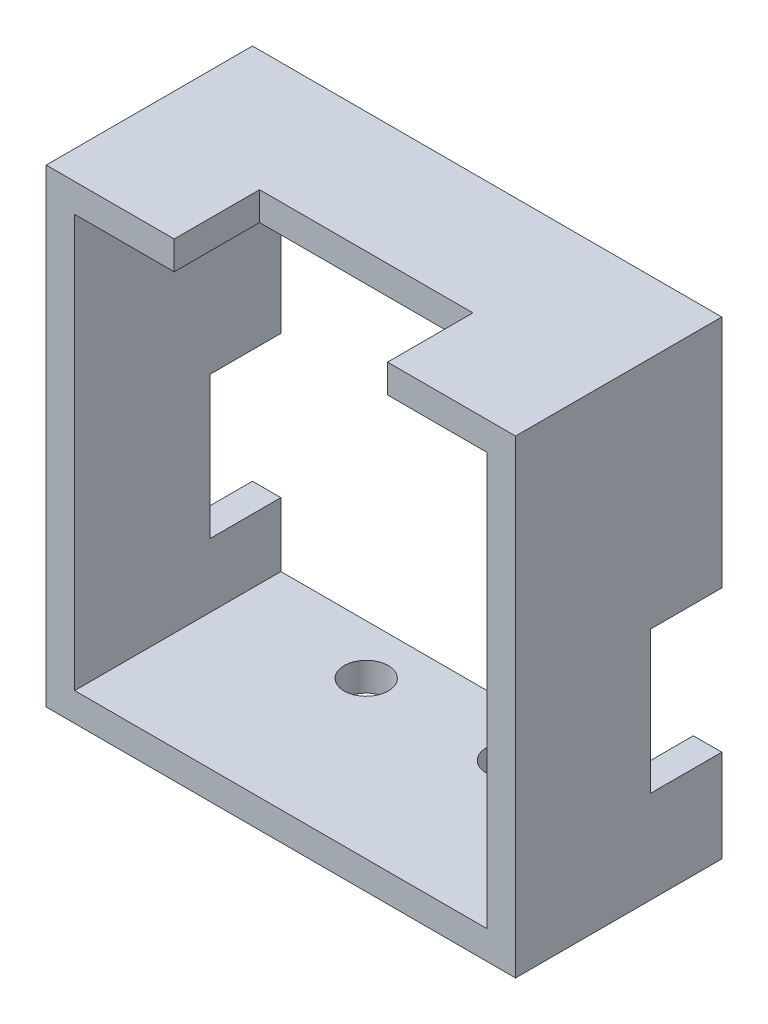
ISO-10303-21;
HEADER;
FILE_DESCRIPTION(('STEP AP214'),'2;1');
FILE_NAME('part.step','',(''),(''),'','','');
FILE_SCHEMA(('AUTOMOTIVE_DESIGN { 1 0 10303 214 1 1 1 1 }'));
ENDSEC;
DATA;
#1=APPLICATION_CONTEXT('core data for automotive mechanical design processes');
#2=APPLICATION_PROTOCOL_DEFINITION('international standard','automotive_design',2000,#1);
#3=PRODUCT_CONTEXT('',#1,'mechanical');
#4=PRODUCT('Part','Part','',(#3));
#5=PRODUCT_RELATED_PRODUCT_CATEGORY('part','',(#4));
#6=PRODUCT_DEFINITION_FORMATION('','',#4);
#7=PRODUCT_DEFINITION_CONTEXT('part definition',#1,'design');
#8=PRODUCT_DEFINITION('design','',#6,#7);
#9=PRODUCT_DEFINITION_SHAPE('','',#8);
#10=(LENGTH_UNIT() NAMED_UNIT(*) SI_UNIT(.MILLI.,.METRE.));
#11=(NAMED_UNIT(*) PLANE_ANGLE_UNIT() SI_UNIT($,.RADIAN.));
#12=(NAMED_UNIT(*) SI_UNIT($,.STERADIAN.) SOLID_ANGLE_UNIT());
#13=UNCERTAINTY_MEASURE_WITH_UNIT(LENGTH_MEASURE(1.E-05),#10,'distance_accuracy_value','');
#14=(GEOMETRIC_REPRESENTATION_CONTEXT(3) GLOBAL_UNCERTAINTY_ASSIGNED_CONTEXT((#13)) GLOBAL_UNIT_ASSIGNED_CONTEXT((#10,
#11,#12)) REPRESENTATION_CONTEXT('',''));
#15=CARTESIAN_POINT('',(0.,0.,0.));
#16=DIRECTION('',(0.,0.,1.));
#17=DIRECTION('',(1.,0.,0.));
#18=AXIS2_PLACEMENT_3D('',#15,#16,#17);
#19=CARTESIAN_POINT('',(0.,0.,0.));
#20=DIRECTION('',(0.,0.,1.));
#21=DIRECTION('',(1.,0.,0.));
#22=AXIS2_PLACEMENT_3D('',#19,#20,#21);
#23=PLANE('',#22);
#24=DIRECTION('',(0.,1.,0.));
#25=VECTOR('',#24,1.);
#26=CARTESIAN_POINT('',(31.,-2.,0.));
#27=LINE('',#26,#25);
#28=CARTESIAN_POINT('',(31.,14.5,0.));
#29=VERTEX_POINT('',#28);
#30=CARTESIAN_POINT('',(31.,31.,0.));
#31=VERTEX_POINT('',#30);
#32=EDGE_CURVE('E196',#29,#31,#27,.T.);
#33=ORIENTED_EDGE('',*,*,#32,.F.);
#34=DIRECTION('',(-1.,0.,0.));
#35=VECTOR('',#34,1.);
#36=CARTESIAN_POINT('',(31.,14.5,0.));
#37=LINE('',#36,#35);
#38=CARTESIAN_POINT('',(29.,14.5,0.));
#39=VERTEX_POINT('',#38);
#40=EDGE_CURVE('E354',#29,#39,#37,.T.);
#41=ORIENTED_EDGE('',*,*,#40,.T.);
#42=DIRECTION('',(0.,1.,0.));
#43=VECTOR('',#42,1.);
#44=CARTESIAN_POINT('',(29.,0.,0.));
#45=LINE('',#44,#43);
#46=CARTESIAN_POINT('',(29.,29.,0.));
#47=VERTEX_POINT('',#46);
#48=EDGE_CURVE('E239',#39,#47,#45,.T.);
#49=ORIENTED_EDGE('',*,*,#48,.T.);
#50=DIRECTION('',(-1.,0.,0.));
#51=VECTOR('',#50,1.);
#52=CARTESIAN_POINT('',(0.,29.,0.));
#53=LINE('',#52,#51);
#54=CARTESIAN_POINT('',(0.,29.,0.));
#55=VERTEX_POINT('',#54);
#56=EDGE_CURVE('E247',#47,#55,#53,.T.);
#57=ORIENTED_EDGE('',*,*,#56,.T.);
#58=DIRECTION('',(0.,-1.,0.));
#59=VECTOR('',#58,1.);
#60=CARTESIAN_POINT('',(0.,0.,0.));
#61=LINE('',#60,#59);
#62=CARTESIAN_POINT('',(0.,14.5,0.));
#63=VERTEX_POINT('',#62);
#64=EDGE_CURVE('E248',#55,#63,#61,.T.);
#65=ORIENTED_EDGE('',*,*,#64,.T.);
#66=CARTESIAN_POINT('',(-2.,14.5,0.));
#67=VERTEX_POINT('',#66);
#68=EDGE_CURVE('E233',#63,#67,#37,.T.);
#69=ORIENTED_EDGE('',*,*,#68,.T.);
#70=DIRECTION('',(0.,-1.,0.));
#71=VECTOR('',#70,1.);
#72=CARTESIAN_POINT('',(-2.,-2.,0.));
#73=LINE('',#72,#71);
#74=CARTESIAN_POINT('',(-2.,31.,0.));
#75=VERTEX_POINT('',#74);
#76=EDGE_CURVE('E204',#75,#67,#73,.T.);
#77=ORIENTED_EDGE('',*,*,#76,.F.);
#78=DIRECTION('',(-1.,0.,0.));
#79=VECTOR('',#78,1.);
#80=CARTESIAN_POINT('',(-2.,31.,0.));
#81=LINE('',#80,#79);
#82=EDGE_CURVE('E195',#31,#75,#81,.T.);
#83=ORIENTED_EDGE('',*,*,#82,.F.);
#84=EDGE_LOOP('',(#33,#41,#49,#57,#65,#69,#77,#83));
#85=FACE_BOUND('',#84,.T.);
#86=ADVANCED_FACE('F35',(#85),#23,.F.);
#87=CARTESIAN_POINT('',(0.,0.,14.5));
#88=DIRECTION('',(0.,0.,1.));
#89=DIRECTION('',(1.,0.,0.));
#90=AXIS2_PLACEMENT_3D('',#87,#88,#89);
#91=PLANE('',#90);
#92=DIRECTION('',(0.,1.,0.));
#93=VECTOR('',#92,1.);
#94=CARTESIAN_POINT('',(22.,-2.001,14.5));
#95=LINE('',#94,#93);
#96=CARTESIAN_POINT('',(22.,29.,14.5));
#97=VERTEX_POINT('',#96);
#98=CARTESIAN_POINT('',(22.,31.,14.5));
#99=VERTEX_POINT('',#98);
#100=EDGE_CURVE('E310',#97,#99,#95,.T.);
#101=ORIENTED_EDGE('',*,*,#100,.F.);
#102=DIRECTION('',(-1.,0.,0.));
#103=VECTOR('',#102,1.);
#104=CARTESIAN_POINT('',(0.,29.,14.5));
#105=LINE('',#104,#103);
#106=CARTESIAN_POINT('',(29.,29.,14.5));
#107=VERTEX_POINT('',#106);
#108=EDGE_CURVE('E257',#107,#97,#105,.T.);
#109=ORIENTED_EDGE('',*,*,#108,.F.);
#110=DIRECTION('',(0.,1.,0.));
#111=VECTOR('',#110,1.);
#112=CARTESIAN_POINT('',(29.,0.,14.5));
#113=LINE('',#112,#111);
#114=CARTESIAN_POINT('',(29.,0.,14.5));
#115=VERTEX_POINT('',#114);
#116=EDGE_CURVE('E303',#115,#107,#113,.T.);
#117=ORIENTED_EDGE('',*,*,#116,.F.);
#118=DIRECTION('',(1.,0.,0.));
#119=VECTOR('',#118,1.);
#120=CARTESIAN_POINT('',(0.,0.,14.5));
#121=LINE('',#120,#119);
#122=CARTESIAN_POINT('',(0.,0.,14.5));
#123=VERTEX_POINT('',#122);
#124=EDGE_CURVE('E305',#123,#115,#121,.T.);
#125=ORIENTED_EDGE('',*,*,#124,.F.);
#126=DIRECTION('',(0.,-1.,0.));
#127=VECTOR('',#126,1.);
#128=CARTESIAN_POINT('',(0.,0.,14.5));
#129=LINE('',#128,#127);
#130=CARTESIAN_POINT('',(0.,29.,14.5));
#131=VERTEX_POINT('',#130);
#132=EDGE_CURVE('E253',#131,#123,#129,.T.);
#133=ORIENTED_EDGE('',*,*,#132,.F.);
#134=CARTESIAN_POINT('',(7.,29.,14.5));
#135=VERTEX_POINT('',#134);
#136=EDGE_CURVE('E302',#135,#131,#105,.T.);
#137=ORIENTED_EDGE('',*,*,#136,.F.);
#138=DIRECTION('',(0.,1.,0.));
#139=VECTOR('',#138,1.);
#140=CARTESIAN_POINT('',(7.,-2.001,14.5));
#141=LINE('',#140,#139);
#142=CARTESIAN_POINT('',(7.,31.,14.5));
#143=VERTEX_POINT('',#142);
#144=EDGE_CURVE('E308',#135,#143,#141,.T.);
#145=ORIENTED_EDGE('',*,*,#144,.T.);
#146=DIRECTION('',(-1.,0.,0.));
#147=VECTOR('',#146,1.);
#148=CARTESIAN_POINT('',(-2.,31.,14.5));
#149=LINE('',#148,#147);
#150=CARTESIAN_POINT('',(-2.,31.,14.5));
#151=VERTEX_POINT('',#150);
#152=EDGE_CURVE('E268',#143,#151,#149,.T.);
#153=ORIENTED_EDGE('',*,*,#152,.T.);
#154=DIRECTION('',(0.,-1.,0.));
#155=VECTOR('',#154,1.);
#156=CARTESIAN_POINT('',(-2.,-2.,14.5));
#157=LINE('',#156,#155);
#158=CARTESIAN_POINT('',(-2.,-2.,14.5));
#159=VERTEX_POINT('',#158);
#160=EDGE_CURVE('E212',#151,#159,#157,.T.);
#161=ORIENTED_EDGE('',*,*,#160,.T.);
#162=DIRECTION('',(1.,0.,0.));
#163=VECTOR('',#162,1.);
#164=CARTESIAN_POINT('',(-2.,-2.,14.5));
#165=LINE('',#164,#163);
#166=CARTESIAN_POINT('',(31.,-2.,14.5));
#167=VERTEX_POINT('',#166);
#168=EDGE_CURVE('E207',#159,#167,#165,.T.);
#169=ORIENTED_EDGE('',*,*,#168,.T.);
#170=DIRECTION('',(0.,1.,0.));
#171=VECTOR('',#170,1.);
#172=CARTESIAN_POINT('',(31.,-2.,14.5));
#173=LINE('',#172,#171);
#174=CARTESIAN_POINT('',(31.,31.,14.5));
#175=VERTEX_POINT('',#174);
#176=EDGE_CURVE('E266',#167,#175,#173,.T.);
#177=ORIENTED_EDGE('',*,*,#176,.T.);
#178=EDGE_CURVE('E269',#175,#99,#149,.T.);
#179=ORIENTED_EDGE('',*,*,#178,.T.);
#180=EDGE_LOOP('',(#101,#109,#117,#125,#133,#137,#145,#153,#161,#169,#177,#179));
#181=FACE_BOUND('',#180,.T.);
#182=ADVANCED_FACE('F275',(#181),#91,.T.);
#183=CARTESIAN_POINT('',(-2.,4.5,0.));
#184=VERTEX_POINT('',#183);
#185=CARTESIAN_POINT('',(-2.,-2.,0.));
#186=VERTEX_POINT('',#185);
#187=EDGE_CURVE('E198',#184,#186,#73,.T.);
#188=ORIENTED_EDGE('',*,*,#187,.F.);
#189=DIRECTION('',(-1.,0.,0.));
#190=VECTOR('',#189,1.);
#191=CARTESIAN_POINT('',(31.,4.5,0.));
#192=LINE('',#191,#190);
#193=CARTESIAN_POINT('',(0.,4.5,0.));
#194=VERTEX_POINT('',#193);
#195=EDGE_CURVE('E189',#194,#184,#192,.T.);
#196=ORIENTED_EDGE('',*,*,#195,.F.);
#197=CARTESIAN_POINT('',(0.,0.,0.));
#198=VERTEX_POINT('',#197);
#199=EDGE_CURVE('E286',#194,#198,#61,.T.);
#200=ORIENTED_EDGE('',*,*,#199,.T.);
#201=DIRECTION('',(1.,0.,0.));
#202=VECTOR('',#201,1.);
#203=CARTESIAN_POINT('',(0.,0.,0.));
#204=LINE('',#203,#202);
#205=CARTESIAN_POINT('',(29.,0.,0.));
#206=VERTEX_POINT('',#205);
#207=EDGE_CURVE('E245',#198,#206,#204,.T.);
#208=ORIENTED_EDGE('',*,*,#207,.T.);
#209=CARTESIAN_POINT('',(29.,4.5,0.));
#210=VERTEX_POINT('',#209);
#211=EDGE_CURVE('E188',#206,#210,#45,.T.);
#212=ORIENTED_EDGE('',*,*,#211,.T.);
#213=CARTESIAN_POINT('',(31.,4.5,0.));
#214=VERTEX_POINT('',#213);
#215=EDGE_CURVE('E58',#214,#210,#192,.T.);
#216=ORIENTED_EDGE('',*,*,#215,.F.);
#217=CARTESIAN_POINT('',(31.,-2.,0.));
#218=VERTEX_POINT('',#217);
#219=EDGE_CURVE('E184',#218,#214,#27,.T.);
#220=ORIENTED_EDGE('',*,*,#219,.F.);
#221=DIRECTION('',(1.,0.,0.));
#222=VECTOR('',#221,1.);
#223=CARTESIAN_POINT('',(-2.,-2.,0.));
#224=LINE('',#223,#222);
#225=EDGE_CURVE('E200',#186,#218,#224,.T.);
#226=ORIENTED_EDGE('',*,*,#225,.F.);
#227=EDGE_LOOP('',(#188,#196,#200,#208,#212,#216,#220,#226));
#228=FACE_BOUND('',#227,.T.);
#229=ADVANCED_FACE('F182',(#228),#23,.F.);
#230=CARTESIAN_POINT('',(-2.,-2.,14.5));
#231=DIRECTION('',(0.,1.,0.));
#232=DIRECTION('',(0.,0.,1.));
#233=AXIS2_PLACEMENT_3D('',#230,#231,#232);
#234=PLANE('',#233);
#235=CARTESIAN_POINT('',(19.5,-2.,3.5));
#236=DIRECTION('',(0.,-1.,0.));
#237=DIRECTION('',(0.,0.,-1.));
#238=AXIS2_PLACEMENT_3D('',#235,#236,#237);
#239=CIRCLE('',#238,1.55);
#240=CARTESIAN_POINT('',(19.5,-2.,1.95000000000001));
#241=VERTEX_POINT('',#240);
#242=EDGE_CURVE('E330',#241,#241,#239,.T.);
#243=ORIENTED_EDGE('',*,*,#242,.F.);
#244=EDGE_LOOP('',(#243));
#245=FACE_BOUND('',#244,.T.);
#246=CARTESIAN_POINT('',(9.49999999999999,-2.,3.5));
#247=DIRECTION('',(0.,-1.,0.));
#248=DIRECTION('',(0.,0.,1.));
#249=AXIS2_PLACEMENT_3D('',#246,#247,#248);
#250=CIRCLE('',#249,1.55);
#251=CARTESIAN_POINT('',(9.49999999999999,-2.,5.05));
#252=VERTEX_POINT('',#251);
#253=EDGE_CURVE('E331',#252,#252,#250,.T.);
#254=ORIENTED_EDGE('',*,*,#253,.F.);
#255=EDGE_LOOP('',(#254));
#256=FACE_BOUND('',#255,.T.);
#257=ORIENTED_EDGE('',*,*,#225,.T.);
#258=DIRECTION('',(0.,0.,-1.));
#259=VECTOR('',#258,1.);
#260=CARTESIAN_POINT('',(31.,-2.,14.5));
#261=LINE('',#260,#259);
#262=EDGE_CURVE('E193',#167,#218,#261,.T.);
#263=ORIENTED_EDGE('',*,*,#262,.F.);
#264=ORIENTED_EDGE('',*,*,#168,.F.);
#265=DIRECTION('',(0.,0.,-1.));
#266=VECTOR('',#265,1.);
#267=CARTESIAN_POINT('',(-2.,-2.,14.5));
#268=LINE('',#267,#266);
#269=EDGE_CURVE('E208',#159,#186,#268,.T.);
#270=ORIENTED_EDGE('',*,*,#269,.T.);
#271=EDGE_LOOP('',(#257,#263,#264,#270));
#272=FACE_BOUND('',#271,.T.);
#273=ADVANCED_FACE('F37',(#245,#256,#272),#234,.F.);
#274=CARTESIAN_POINT('',(31.,-2.,14.5));
#275=DIRECTION('',(-1.,0.,0.));
#276=DIRECTION('',(0.,-1.,0.));
#277=AXIS2_PLACEMENT_3D('',#274,#275,#276);
#278=PLANE('',#277);
#279=DIRECTION('',(0.,1.,0.));
#280=VECTOR('',#279,1.);
#281=CARTESIAN_POINT('',(31.,14.5,5.));
#282=LINE('',#281,#280);
#283=CARTESIAN_POINT('',(31.,4.5,5.));
#284=VERTEX_POINT('',#283);
#285=CARTESIAN_POINT('',(31.,14.5,5.));
#286=VERTEX_POINT('',#285);
#287=EDGE_CURVE('E177',#284,#286,#282,.T.);
#288=ORIENTED_EDGE('',*,*,#287,.T.);
#289=DIRECTION('',(0.,0.,-1.));
#290=VECTOR('',#289,1.);
#291=CARTESIAN_POINT('',(31.,14.5,0.));
#292=LINE('',#291,#290);
#293=EDGE_CURVE('E232',#286,#29,#292,.T.);
#294=ORIENTED_EDGE('',*,*,#293,.T.);
#295=ORIENTED_EDGE('',*,*,#32,.T.);
#296=DIRECTION('',(0.,0.,-1.));
#297=VECTOR('',#296,1.);
#298=CARTESIAN_POINT('',(31.,31.,14.5));
#299=LINE('',#298,#297);
#300=EDGE_CURVE('E215',#175,#31,#299,.T.);
#301=ORIENTED_EDGE('',*,*,#300,.F.);
#302=ORIENTED_EDGE('',*,*,#176,.F.);
#303=ORIENTED_EDGE('',*,*,#262,.T.);
#304=ORIENTED_EDGE('',*,*,#219,.T.);
#305=DIRECTION('',(0.,0.,1.));
#306=VECTOR('',#305,1.);
#307=CARTESIAN_POINT('',(31.,4.5,0.));
#308=LINE('',#307,#306);
#309=EDGE_CURVE('E169',#214,#284,#308,.T.);
#310=ORIENTED_EDGE('',*,*,#309,.T.);
#311=EDGE_LOOP('',(#288,#294,#295,#301,#302,#303,#304,#310));
#312=FACE_BOUND('',#311,.T.);
#313=ADVANCED_FACE('F191',(#312),#278,.F.);
#314=CARTESIAN_POINT('',(-2.,31.,14.5));
#315=DIRECTION('',(0.,-1.,0.));
#316=DIRECTION('',(1.,0.,0.));
#317=AXIS2_PLACEMENT_3D('',#314,#315,#316);
#318=PLANE('',#317);
#319=DIRECTION('',(-1.,0.,0.));
#320=VECTOR('',#319,1.);
#321=CARTESIAN_POINT('',(22.,31.,8.49999999999999));
#322=LINE('',#321,#320);
#323=CARTESIAN_POINT('',(22.,31.,8.49999999999999));
#324=VERTEX_POINT('',#323);
#325=CARTESIAN_POINT('',(7.,31.,8.5));
#326=VERTEX_POINT('',#325);
#327=EDGE_CURVE('E311',#324,#326,#322,.T.);
#328=ORIENTED_EDGE('',*,*,#327,.F.);
#329=DIRECTION('',(0.,0.,-1.));
#330=VECTOR('',#329,1.);
#331=CARTESIAN_POINT('',(22.,31.,14.5));
#332=LINE('',#331,#330);
#333=EDGE_CURVE('E316',#99,#324,#332,.T.);
#334=ORIENTED_EDGE('',*,*,#333,.F.);
#335=ORIENTED_EDGE('',*,*,#178,.F.);
#336=ORIENTED_EDGE('',*,*,#300,.T.);
#337=ORIENTED_EDGE('',*,*,#82,.T.);
#338=DIRECTION('',(0.,0.,-1.));
#339=VECTOR('',#338,1.);
#340=CARTESIAN_POINT('',(-2.,31.,14.5));
#341=LINE('',#340,#339);
#342=EDGE_CURVE('E211',#151,#75,#341,.T.);
#343=ORIENTED_EDGE('',*,*,#342,.F.);
#344=ORIENTED_EDGE('',*,*,#152,.F.);
#345=DIRECTION('',(0.,0.,1.));
#346=VECTOR('',#345,1.);
#347=CARTESIAN_POINT('',(7.,31.,14.5));
#348=LINE('',#347,#346);
#349=EDGE_CURVE('E319',#326,#143,#348,.T.);
#350=ORIENTED_EDGE('',*,*,#349,.F.);
#351=EDGE_LOOP('',(#328,#334,#335,#336,#337,#343,#344,#350));
#352=FACE_BOUND('',#351,.T.);
#353=ADVANCED_FACE('F366',(#352),#318,.F.);
#354=CARTESIAN_POINT('',(-2.,-2.,14.5));
#355=DIRECTION('',(1.,0.,0.));
#356=DIRECTION('',(0.,0.,-1.));
#357=AXIS2_PLACEMENT_3D('',#354,#355,#356);
#358=PLANE('',#357);
#359=ORIENTED_EDGE('',*,*,#76,.T.);
#360=DIRECTION('',(0.,0.,1.));
#361=VECTOR('',#360,1.);
#362=CARTESIAN_POINT('',(-2.,14.5,14.5));
#363=LINE('',#362,#361);
#364=CARTESIAN_POINT('',(-2.,14.5,5.));
#365=VERTEX_POINT('',#364);
#366=EDGE_CURVE('E338',#67,#365,#363,.T.);
#367=ORIENTED_EDGE('',*,*,#366,.T.);
#368=DIRECTION('',(0.,-1.,0.));
#369=VECTOR('',#368,1.);
#370=CARTESIAN_POINT('',(-2.,-2.,5.));
#371=LINE('',#370,#369);
#372=CARTESIAN_POINT('',(-2.,4.5,5.));
#373=VERTEX_POINT('',#372);
#374=EDGE_CURVE('E347',#365,#373,#371,.T.);
#375=ORIENTED_EDGE('',*,*,#374,.T.);
#376=DIRECTION('',(0.,0.,-1.));
#377=VECTOR('',#376,1.);
#378=CARTESIAN_POINT('',(-2.,4.5,14.5));
#379=LINE('',#378,#377);
#380=EDGE_CURVE('E352',#373,#184,#379,.T.);
#381=ORIENTED_EDGE('',*,*,#380,.T.);
#382=ORIENTED_EDGE('',*,*,#187,.T.);
#383=ORIENTED_EDGE('',*,*,#269,.F.);
#384=ORIENTED_EDGE('',*,*,#160,.F.);
#385=ORIENTED_EDGE('',*,*,#342,.T.);
#386=EDGE_LOOP('',(#359,#367,#375,#381,#382,#383,#384,#385));
#387=FACE_BOUND('',#386,.T.);
#388=ADVANCED_FACE('F281',(#387),#358,.F.);
#389=CARTESIAN_POINT('',(0.,0.,14.5));
#390=DIRECTION('',(1.,0.,0.));
#391=DIRECTION('',(0.,1.,0.));
#392=AXIS2_PLACEMENT_3D('',#389,#390,#391);
#393=PLANE('',#392);
#394=DIRECTION('',(0.,0.,1.));
#395=VECTOR('',#394,1.);
#396=CARTESIAN_POINT('',(0.,14.5,14.5));
#397=LINE('',#396,#395);
#398=CARTESIAN_POINT('',(0.,14.5,5.));
#399=VERTEX_POINT('',#398);
#400=EDGE_CURVE('E345',#63,#399,#397,.T.);
#401=ORIENTED_EDGE('',*,*,#400,.F.);
#402=ORIENTED_EDGE('',*,*,#64,.F.);
#403=DIRECTION('',(0.,0.,-1.));
#404=VECTOR('',#403,1.);
#405=CARTESIAN_POINT('',(0.,29.,14.5));
#406=LINE('',#405,#404);
#407=EDGE_CURVE('E254',#131,#55,#406,.T.);
#408=ORIENTED_EDGE('',*,*,#407,.F.);
#409=ORIENTED_EDGE('',*,*,#132,.T.);
#410=DIRECTION('',(0.,0.,-1.));
#411=VECTOR('',#410,1.);
#412=CARTESIAN_POINT('',(0.,0.,14.5));
#413=LINE('',#412,#411);
#414=EDGE_CURVE('E261',#123,#198,#413,.T.);
#415=ORIENTED_EDGE('',*,*,#414,.T.);
#416=ORIENTED_EDGE('',*,*,#199,.F.);
#417=DIRECTION('',(0.,0.,-1.));
#418=VECTOR('',#417,1.);
#419=CARTESIAN_POINT('',(0.,4.5,14.5));
#420=LINE('',#419,#418);
#421=CARTESIAN_POINT('',(0.,4.5,5.));
#422=VERTEX_POINT('',#421);
#423=EDGE_CURVE('E293',#422,#194,#420,.T.);
#424=ORIENTED_EDGE('',*,*,#423,.F.);
#425=DIRECTION('',(0.,-1.,0.));
#426=VECTOR('',#425,1.);
#427=CARTESIAN_POINT('',(0.,0.,5.));
#428=LINE('',#427,#426);
#429=EDGE_CURVE('E350',#399,#422,#428,.T.);
#430=ORIENTED_EDGE('',*,*,#429,.F.);
#431=EDGE_LOOP('',(#401,#402,#408,#409,#415,#416,#424,#430));
#432=FACE_BOUND('',#431,.T.);
#433=ADVANCED_FACE('F291',(#432),#393,.T.);
#434=CARTESIAN_POINT('',(0.,0.,14.5));
#435=DIRECTION('',(0.,1.,0.));
#436=DIRECTION('',(0.,0.,1.));
#437=AXIS2_PLACEMENT_3D('',#434,#435,#436);
#438=PLANE('',#437);
#439=CARTESIAN_POINT('',(19.5,0.,3.5));
#440=DIRECTION('',(0.,1.,0.));
#441=DIRECTION('',(0.,0.,1.));
#442=AXIS2_PLACEMENT_3D('',#439,#440,#441);
#443=CIRCLE('',#442,1.55);
#444=CARTESIAN_POINT('',(19.5,0.,5.05));
#445=VERTEX_POINT('',#444);
#446=EDGE_CURVE('E334',#445,#445,#443,.F.);
#447=ORIENTED_EDGE('',*,*,#446,.T.);
#448=EDGE_LOOP('',(#447));
#449=FACE_BOUND('',#448,.T.);
#450=CARTESIAN_POINT('',(9.49999999999999,0.,3.5));
#451=DIRECTION('',(0.,1.,0.));
#452=DIRECTION('',(0.,0.,1.));
#453=AXIS2_PLACEMENT_3D('',#450,#451,#452);
#454=CIRCLE('',#453,1.55);
#455=CARTESIAN_POINT('',(9.49999999999999,0.,5.05));
#456=VERTEX_POINT('',#455);
#457=EDGE_CURVE('E335',#456,#456,#454,.F.);
#458=ORIENTED_EDGE('',*,*,#457,.T.);
#459=EDGE_LOOP('',(#458));
#460=FACE_BOUND('',#459,.T.);
#461=ORIENTED_EDGE('',*,*,#207,.F.);
#462=ORIENTED_EDGE('',*,*,#414,.F.);
#463=ORIENTED_EDGE('',*,*,#124,.T.);
#464=DIRECTION('',(0.,0.,-1.));
#465=VECTOR('',#464,1.);
#466=CARTESIAN_POINT('',(29.,0.,14.5));
#467=LINE('',#466,#465);
#468=EDGE_CURVE('E259',#115,#206,#467,.T.);
#469=ORIENTED_EDGE('',*,*,#468,.T.);
#470=EDGE_LOOP('',(#461,#462,#463,#469));
#471=FACE_BOUND('',#470,.T.);
#472=ADVANCED_FACE('F380',(#449,#460,#471),#438,.T.);
#473=CARTESIAN_POINT('',(29.,0.,14.5));
#474=DIRECTION('',(-1.,0.,0.));
#475=DIRECTION('',(0.,-1.,0.));
#476=AXIS2_PLACEMENT_3D('',#473,#474,#475);
#477=PLANE('',#476);
#478=DIRECTION('',(0.,0.,-1.));
#479=VECTOR('',#478,1.);
#480=CARTESIAN_POINT('',(29.,14.5,14.5));
#481=LINE('',#480,#479);
#482=CARTESIAN_POINT('',(29.,14.5,5.));
#483=VERTEX_POINT('',#482);
#484=EDGE_CURVE('E11',#483,#39,#481,.T.);
#485=ORIENTED_EDGE('',*,*,#484,.F.);
#486=DIRECTION('',(0.,1.,0.));
#487=VECTOR('',#486,1.);
#488=CARTESIAN_POINT('',(29.,0.,5.));
#489=LINE('',#488,#487);
#490=CARTESIAN_POINT('',(29.,4.5,5.));
#491=VERTEX_POINT('',#490);
#492=EDGE_CURVE('E43',#491,#483,#489,.T.);
#493=ORIENTED_EDGE('',*,*,#492,.F.);
#494=DIRECTION('',(0.,0.,1.));
#495=VECTOR('',#494,1.);
#496=CARTESIAN_POINT('',(29.,4.5,14.5));
#497=LINE('',#496,#495);
#498=EDGE_CURVE('E219',#210,#491,#497,.T.);
#499=ORIENTED_EDGE('',*,*,#498,.F.);
#500=ORIENTED_EDGE('',*,*,#211,.F.);
#501=ORIENTED_EDGE('',*,*,#468,.F.);
#502=ORIENTED_EDGE('',*,*,#116,.T.);
#503=DIRECTION('',(0.,0.,-1.));
#504=VECTOR('',#503,1.);
#505=CARTESIAN_POINT('',(29.,29.,14.5));
#506=LINE('',#505,#504);
#507=EDGE_CURVE('E241',#107,#47,#506,.T.);
#508=ORIENTED_EDGE('',*,*,#507,.T.);
#509=ORIENTED_EDGE('',*,*,#48,.F.);
#510=EDGE_LOOP('',(#485,#493,#499,#500,#501,#502,#508,#509));
#511=FACE_BOUND('',#510,.T.);
#512=ADVANCED_FACE('F237',(#511),#477,.T.);
#513=CARTESIAN_POINT('',(0.,29.,14.5));
#514=DIRECTION('',(0.,-1.,0.));
#515=DIRECTION('',(0.,0.,-1.));
#516=AXIS2_PLACEMENT_3D('',#513,#514,#515);
#517=PLANE('',#516);
#518=DIRECTION('',(0.,0.,-1.));
#519=VECTOR('',#518,1.);
#520=CARTESIAN_POINT('',(22.,29.,14.5));
#521=LINE('',#520,#519);
#522=CARTESIAN_POINT('',(22.,29.,8.49999999999999));
#523=VERTEX_POINT('',#522);
#524=EDGE_CURVE('E327',#97,#523,#521,.T.);
#525=ORIENTED_EDGE('',*,*,#524,.T.);
#526=DIRECTION('',(-1.,0.,0.));
#527=VECTOR('',#526,1.);
#528=CARTESIAN_POINT('',(22.,29.,8.49999999999999));
#529=LINE('',#528,#527);
#530=CARTESIAN_POINT('',(7.,29.,8.5));
#531=VERTEX_POINT('',#530);
#532=EDGE_CURVE('E324',#523,#531,#529,.T.);
#533=ORIENTED_EDGE('',*,*,#532,.T.);
#534=DIRECTION('',(0.,0.,1.));
#535=VECTOR('',#534,1.);
#536=CARTESIAN_POINT('',(7.,29.,14.5));
#537=LINE('',#536,#535);
#538=EDGE_CURVE('E321',#531,#135,#537,.T.);
#539=ORIENTED_EDGE('',*,*,#538,.T.);
#540=ORIENTED_EDGE('',*,*,#136,.T.);
#541=ORIENTED_EDGE('',*,*,#407,.T.);
#542=ORIENTED_EDGE('',*,*,#56,.F.);
#543=ORIENTED_EDGE('',*,*,#507,.F.);
#544=ORIENTED_EDGE('',*,*,#108,.T.);
#545=EDGE_LOOP('',(#525,#533,#539,#540,#541,#542,#543,#544));
#546=FACE_BOUND('',#545,.T.);
#547=ADVANCED_FACE('F375',(#546),#517,.T.);
#548=CARTESIAN_POINT('',(22.,-2.001,14.5));
#549=DIRECTION('',(1.,0.,0.));
#550=DIRECTION('',(0.,0.,-1.));
#551=AXIS2_PLACEMENT_3D('',#548,#549,#550);
#552=PLANE('',#551);
#553=ORIENTED_EDGE('',*,*,#100,.T.);
#554=ORIENTED_EDGE('',*,*,#333,.T.);
#555=DIRECTION('',(0.,1.,0.));
#556=VECTOR('',#555,1.);
#557=CARTESIAN_POINT('',(22.,-2.001,8.49999999999999));
#558=LINE('',#557,#556);
#559=EDGE_CURVE('E297',#523,#324,#558,.T.);
#560=ORIENTED_EDGE('',*,*,#559,.F.);
#561=ORIENTED_EDGE('',*,*,#524,.F.);
#562=EDGE_LOOP('',(#553,#554,#560,#561));
#563=FACE_BOUND('',#562,.T.);
#564=ADVANCED_FACE('F385',(#563),#552,.F.);
#565=CARTESIAN_POINT('',(22.,-2.001,8.49999999999999));
#566=DIRECTION('',(0.,0.,-1.));
#567=DIRECTION('',(-1.,0.,0.));
#568=AXIS2_PLACEMENT_3D('',#565,#566,#567);
#569=PLANE('',#568);
#570=ORIENTED_EDGE('',*,*,#559,.T.);
#571=ORIENTED_EDGE('',*,*,#327,.T.);
#572=DIRECTION('',(0.,1.,0.));
#573=VECTOR('',#572,1.);
#574=CARTESIAN_POINT('',(7.,-2.001,8.5));
#575=LINE('',#574,#573);
#576=EDGE_CURVE('E295',#531,#326,#575,.T.);
#577=ORIENTED_EDGE('',*,*,#576,.F.);
#578=ORIENTED_EDGE('',*,*,#532,.F.);
#579=EDGE_LOOP('',(#570,#571,#577,#578));
#580=FACE_BOUND('',#579,.T.);
#581=ADVANCED_FACE('F388',(#580),#569,.F.);
#582=CARTESIAN_POINT('',(7.,-2.001,14.5));
#583=DIRECTION('',(-1.,0.,0.));
#584=DIRECTION('',(0.,0.,1.));
#585=AXIS2_PLACEMENT_3D('',#582,#583,#584);
#586=PLANE('',#585);
#587=ORIENTED_EDGE('',*,*,#576,.T.);
#588=ORIENTED_EDGE('',*,*,#349,.T.);
#589=ORIENTED_EDGE('',*,*,#144,.F.);
#590=ORIENTED_EDGE('',*,*,#538,.F.);
#591=EDGE_LOOP('',(#587,#588,#589,#590));
#592=FACE_BOUND('',#591,.T.);
#593=ADVANCED_FACE('F392',(#592),#586,.F.);
#594=CARTESIAN_POINT('',(9.49999999999999,31.001,3.5));
#595=DIRECTION('',(0.,-1.,0.));
#596=DIRECTION('',(0.,0.,-1.));
#597=AXIS2_PLACEMENT_3D('',#594,#595,#596);
#598=CYLINDRICAL_SURFACE('',#597,1.55);
#599=ORIENTED_EDGE('',*,*,#457,.F.);
#600=EDGE_LOOP('',(#599));
#601=FACE_BOUND('',#600,.T.);
#602=ORIENTED_EDGE('',*,*,#253,.T.);
#603=EDGE_LOOP('',(#602));
#604=FACE_BOUND('',#603,.T.);
#605=ADVANCED_FACE('F394',(#601,#604),#598,.F.);
#606=CARTESIAN_POINT('',(19.5,31.001,3.5));
#607=DIRECTION('',(0.,-1.,0.));
#608=DIRECTION('',(0.,0.,-1.));
#609=AXIS2_PLACEMENT_3D('',#606,#607,#608);
#610=CYLINDRICAL_SURFACE('',#609,1.55);
#611=ORIENTED_EDGE('',*,*,#446,.F.);
#612=EDGE_LOOP('',(#611));
#613=FACE_BOUND('',#612,.T.);
#614=ORIENTED_EDGE('',*,*,#242,.T.);
#615=EDGE_LOOP('',(#614));
#616=FACE_BOUND('',#615,.T.);
#617=ADVANCED_FACE('F400',(#613,#616),#610,.F.);
#618=CARTESIAN_POINT('',(31.,4.5,0.));
#619=DIRECTION('',(0.,-1.,0.));
#620=DIRECTION('',(0.,0.,-1.));
#621=AXIS2_PLACEMENT_3D('',#618,#619,#620);
#622=PLANE('',#621);
#623=ORIENTED_EDGE('',*,*,#498,.T.);
#624=DIRECTION('',(-1.,0.,0.));
#625=VECTOR('',#624,1.);
#626=CARTESIAN_POINT('',(31.,4.5,5.));
#627=LINE('',#626,#625);
#628=EDGE_CURVE('E172',#284,#491,#627,.T.);
#629=ORIENTED_EDGE('',*,*,#628,.F.);
#630=ORIENTED_EDGE('',*,*,#309,.F.);
#631=ORIENTED_EDGE('',*,*,#215,.T.);
#632=EDGE_LOOP('',(#623,#629,#630,#631));
#633=FACE_BOUND('',#632,.T.);
#634=ADVANCED_FACE('F170',(#633),#622,.F.);
#635=CARTESIAN_POINT('',(31.,14.5,5.));
#636=DIRECTION('',(0.,0.,1.));
#637=DIRECTION('',(0.,-1.,0.));
#638=AXIS2_PLACEMENT_3D('',#635,#636,#637);
#639=PLANE('',#638);
#640=ORIENTED_EDGE('',*,*,#492,.T.);
#641=DIRECTION('',(-1.,0.,0.));
#642=VECTOR('',#641,1.);
#643=CARTESIAN_POINT('',(31.,14.5,5.));
#644=LINE('',#643,#642);
#645=EDGE_CURVE('E224',#286,#483,#644,.T.);
#646=ORIENTED_EDGE('',*,*,#645,.F.);
#647=ORIENTED_EDGE('',*,*,#287,.F.);
#648=ORIENTED_EDGE('',*,*,#628,.T.);
#649=EDGE_LOOP('',(#640,#646,#647,#648));
#650=FACE_BOUND('',#649,.T.);
#651=ADVANCED_FACE('F223',(#650),#639,.F.);
#652=CARTESIAN_POINT('',(31.,14.5,0.));
#653=DIRECTION('',(0.,1.,0.));
#654=DIRECTION('',(0.,0.,1.));
#655=AXIS2_PLACEMENT_3D('',#652,#653,#654);
#656=PLANE('',#655);
#657=ORIENTED_EDGE('',*,*,#484,.T.);
#658=ORIENTED_EDGE('',*,*,#40,.F.);
#659=ORIENTED_EDGE('',*,*,#293,.F.);
#660=ORIENTED_EDGE('',*,*,#645,.T.);
#661=EDGE_LOOP('',(#657,#658,#659,#660));
#662=FACE_BOUND('',#661,.T.);
#663=ADVANCED_FACE('F229',(#662),#656,.F.);
#664=ORIENTED_EDGE('',*,*,#68,.F.);
#665=ORIENTED_EDGE('',*,*,#400,.T.);
#666=EDGE_CURVE('E234',#399,#365,#644,.T.);
#667=ORIENTED_EDGE('',*,*,#666,.T.);
#668=ORIENTED_EDGE('',*,*,#366,.F.);
#669=EDGE_LOOP('',(#664,#665,#667,#668));
#670=FACE_BOUND('',#669,.T.);
#671=ADVANCED_FACE('F370',(#670),#656,.F.);
#672=ORIENTED_EDGE('',*,*,#666,.F.);
#673=ORIENTED_EDGE('',*,*,#429,.T.);
#674=EDGE_CURVE('E50',#422,#373,#627,.T.);
#675=ORIENTED_EDGE('',*,*,#674,.T.);
#676=ORIENTED_EDGE('',*,*,#374,.F.);
#677=EDGE_LOOP('',(#672,#673,#675,#676));
#678=FACE_BOUND('',#677,.T.);
#679=ADVANCED_FACE('F498',(#678),#639,.F.);
#680=ORIENTED_EDGE('',*,*,#674,.F.);
#681=ORIENTED_EDGE('',*,*,#423,.T.);
#682=ORIENTED_EDGE('',*,*,#195,.T.);
#683=ORIENTED_EDGE('',*,*,#380,.F.);
#684=EDGE_LOOP('',(#680,#681,#682,#683));
#685=FACE_BOUND('',#684,.T.);
#686=ADVANCED_FACE('F433',(#685),#622,.F.);
#687=CLOSED_SHELL('',(#86,#182,#229,#273,#313,#353,#388,#433,#472,#512,#547,#564,#581,#593,#605,
#617,#634,#651,#663,#671,#679,#686));
#688=MANIFOLD_SOLID_BREP('B2',#687);
#689=ADVANCED_BREP_SHAPE_REPRESENTATION('',(#18,#688),#14);
#690=SHAPE_DEFINITION_REPRESENTATION(#9,#689);
ENDSEC;
END-ISO-10303-21;
